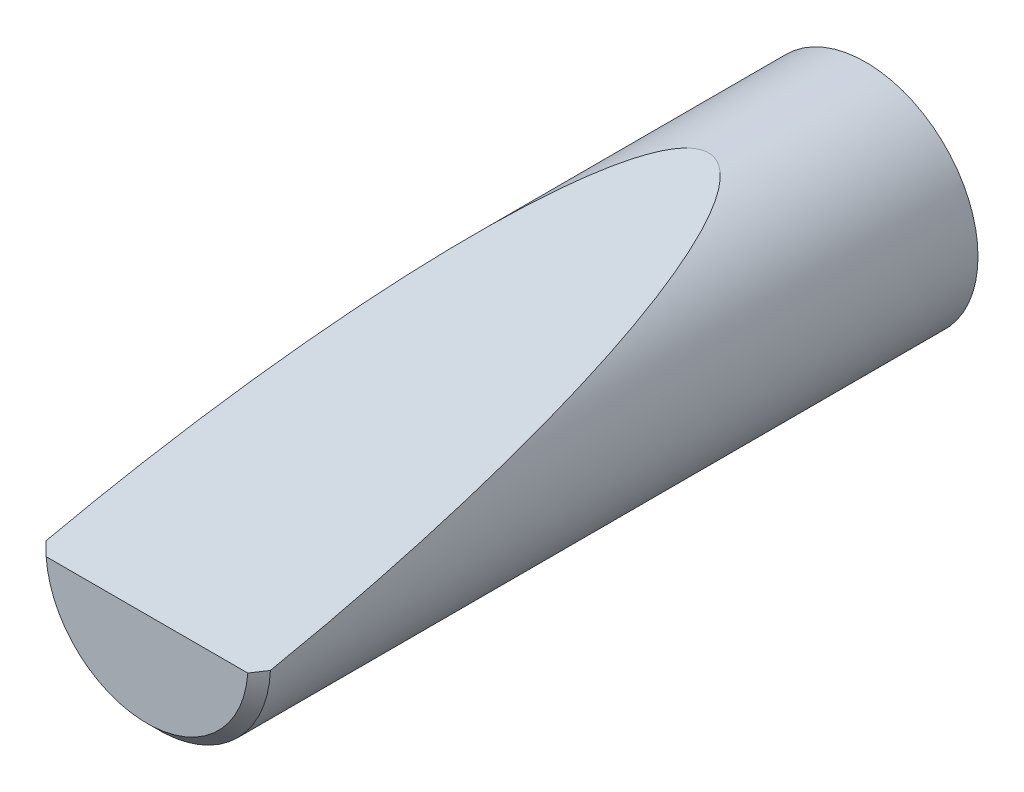
ISO-10303-21;
HEADER;
FILE_DESCRIPTION(('STEP AP214'),'2;1');
FILE_NAME('part.step','',(''),(''),'','','');
FILE_SCHEMA(('AUTOMOTIVE_DESIGN { 1 0 10303 214 1 1 1 1 }'));
ENDSEC;
DATA;
#1=APPLICATION_CONTEXT('core data for automotive mechanical design processes');
#2=APPLICATION_PROTOCOL_DEFINITION('international standard','automotive_design',2000,#1);
#3=PRODUCT_CONTEXT('',#1,'mechanical');
#4=PRODUCT('Part','Part','',(#3));
#5=PRODUCT_RELATED_PRODUCT_CATEGORY('part','',(#4));
#6=PRODUCT_DEFINITION_FORMATION('','',#4);
#7=PRODUCT_DEFINITION_CONTEXT('part definition',#1,'design');
#8=PRODUCT_DEFINITION('design','',#6,#7);
#9=PRODUCT_DEFINITION_SHAPE('','',#8);
#10=(LENGTH_UNIT() NAMED_UNIT(*) SI_UNIT(.MILLI.,.METRE.));
#11=(NAMED_UNIT(*) PLANE_ANGLE_UNIT() SI_UNIT($,.RADIAN.));
#12=(NAMED_UNIT(*) SI_UNIT($,.STERADIAN.) SOLID_ANGLE_UNIT());
#13=UNCERTAINTY_MEASURE_WITH_UNIT(LENGTH_MEASURE(1.E-05),#10,'distance_accuracy_value','');
#14=(GEOMETRIC_REPRESENTATION_CONTEXT(3) GLOBAL_UNCERTAINTY_ASSIGNED_CONTEXT((#13)) GLOBAL_UNIT_ASSIGNED_CONTEXT((#10,
#11,#12)) REPRESENTATION_CONTEXT('',''));
#15=CARTESIAN_POINT('',(0.,0.,0.));
#16=DIRECTION('',(0.,0.,1.));
#17=DIRECTION('',(1.,0.,0.));
#18=AXIS2_PLACEMENT_3D('',#15,#16,#17);
#19=CARTESIAN_POINT('',(0.,0.,0.));
#20=DIRECTION('',(0.,0.,1.));
#21=DIRECTION('',(1.,0.,0.));
#22=AXIS2_PLACEMENT_3D('',#19,#20,#21);
#23=PLANE('',#22);
#24=CARTESIAN_POINT('',(0.,0.,0.));
#25=DIRECTION('',(0.,0.,1.));
#26=DIRECTION('',(1.,0.,0.));
#27=AXIS2_PLACEMENT_3D('',#24,#25,#26);
#28=CIRCLE('',#27,10.);
#29=CARTESIAN_POINT('',(10.,0.,0.));
#30=VERTEX_POINT('',#29);
#31=EDGE_CURVE('E95',#30,#30,#28,.T.);
#32=ORIENTED_EDGE('',*,*,#31,.F.);
#33=EDGE_LOOP('',(#32));
#34=FACE_BOUND('',#33,.T.);
#35=CARTESIAN_POINT('',(0.,0.,0.));
#36=DIRECTION('',(0.,0.,-1.));
#37=DIRECTION('',(-1.,0.,0.));
#38=AXIS2_PLACEMENT_3D('',#35,#36,#37);
#39=CIRCLE('',#38,6.);
#40=CARTESIAN_POINT('',(-6.,0.,0.));
#41=VERTEX_POINT('',#40);
#42=EDGE_CURVE('E90',#41,#41,#39,.T.);
#43=ORIENTED_EDGE('',*,*,#42,.F.);
#44=EDGE_LOOP('',(#43));
#45=FACE_BOUND('',#44,.T.);
#46=ADVANCED_FACE('F41',(#34,#45),#23,.F.);
#47=CARTESIAN_POINT('',(0.,0.,64.));
#48=DIRECTION('',(0.,0.,-1.));
#49=DIRECTION('',(-1.,0.,0.));
#50=AXIS2_PLACEMENT_3D('',#47,#48,#49);
#51=CYLINDRICAL_SURFACE('',#50,10.);
#52=ORIENTED_EDGE('',*,*,#31,.T.);
#53=EDGE_LOOP('',(#52));
#54=FACE_BOUND('',#53,.T.);
#55=CARTESIAN_POINT('',(0.,0.,63.));
#56=DIRECTION('',(0.,0.,1.));
#57=DIRECTION('',(1.,0.,0.));
#58=AXIS2_PLACEMENT_3D('',#55,#56,#57);
#59=CIRCLE('',#58,10.);
#60=CARTESIAN_POINT('',(9.99137375755488,-0.415271521830745,63.));
#61=VERTEX_POINT('',#60);
#62=CARTESIAN_POINT('',(-9.99137375755488,-0.415271521830745,63.));
#63=VERTEX_POINT('',#62);
#64=EDGE_CURVE('E101',#61,#63,#59,.F.);
#65=ORIENTED_EDGE('',*,*,#64,.T.);
#66=CARTESIAN_POINT('',(0.,0.,61.0463010947861));
#67=DIRECTION('',(0.,0.978147600733807,0.207911690817753));
#68=DIRECTION('',(0.,0.207911690817753,-0.978147600733807));
#69=AXIS2_PLACEMENT_3D('',#66,#67,#68);
#70=ELLIPSE('',#69,48.0973434474428,10.);
#71=EDGE_CURVE('E68',#61,#63,#70,.T.);
#72=ORIENTED_EDGE('',*,*,#71,.F.);
#73=EDGE_LOOP('',(#65,#72));
#74=FACE_BOUND('',#73,.T.);
#75=ADVANCED_FACE('F115',(#54,#74),#51,.T.);
#76=CARTESIAN_POINT('',(0.,0.,64.));
#77=DIRECTION('',(0.,0.,1.));
#78=DIRECTION('',(1.,0.,0.));
#79=AXIS2_PLACEMENT_3D('',#76,#77,#78);
#80=PLANE('',#79);
#81=CARTESIAN_POINT('',(0.,0.,64.));
#82=DIRECTION('',(0.,0.,1.));
#83=DIRECTION('',(1.,0.,0.));
#84=AXIS2_PLACEMENT_3D('',#81,#82,#83);
#85=CIRCLE('',#84,9.00000000000001);
#86=CARTESIAN_POINT('',(-8.97807506638076,-0.627828083500761,64.));
#87=VERTEX_POINT('',#86);
#88=CARTESIAN_POINT('',(8.97807506638076,-0.627828083500761,64.));
#89=VERTEX_POINT('',#88);
#90=EDGE_CURVE('E98',#87,#89,#85,.T.);
#91=ORIENTED_EDGE('',*,*,#90,.T.);
#92=DIRECTION('',(-1.,0.,0.));
#93=VECTOR('',#92,1.);
#94=CARTESIAN_POINT('',(99.9642784226795,-0.627828083500761,64.));
#95=LINE('',#94,#93);
#96=EDGE_CURVE('E63',#89,#87,#95,.T.);
#97=ORIENTED_EDGE('',*,*,#96,.T.);
#98=EDGE_LOOP('',(#91,#97));
#99=FACE_BOUND('',#98,.T.);
#100=ADVANCED_FACE('F111',(#99),#80,.T.);
#101=CARTESIAN_POINT('',(0.,0.,64.));
#102=DIRECTION('',(0.,0.,-1.));
#103=DIRECTION('',(-1.,0.,0.));
#104=AXIS2_PLACEMENT_3D('',#101,#102,#103);
#105=CONICAL_SURFACE('',#104,9.00000000000001,0.785398163397444);
#106=ORIENTED_EDGE('',*,*,#90,.F.);
#107=CARTESIAN_POINT('',(-8.97787160501692,-0.627870594813096,64.0002));
#108=CARTESIAN_POINT('',(-9.14714145675765,-0.592496099746864,63.8337760854038));
#109=CARTESIAN_POINT('',(-9.3162517275177,-0.557088719369856,63.6671974575844));
#110=CARTESIAN_POINT('',(-9.65415309148165,-0.486208191265557,63.3337307908891));
#111=CARTESIAN_POINT('',(-9.82294418471501,-0.450735043544336,63.1668427520419));
#112=CARTESIAN_POINT('',(-9.99157569699715,-0.41522901051841,62.9998));
#113=B_SPLINE_CURVE_WITH_KNOTS('',3,(#107,#108,#109,#110,#111,#112),.UNSPECIFIED.,.F.,.F.,(4,2,
4),(0.,0.720002534419931,1.44000500238097),.UNSPECIFIED.);
#114=EDGE_CURVE('E11',#87,#63,#113,.T.);
#115=ORIENTED_EDGE('',*,*,#114,.T.);
#116=ORIENTED_EDGE('',*,*,#64,.F.);
#117=CARTESIAN_POINT('',(9.99157569699715,-0.41522901051841,62.9998));
#118=CARTESIAN_POINT('',(9.82294418471501,-0.450735043544336,63.1668427520419));
#119=CARTESIAN_POINT('',(9.65415309148165,-0.486208191265556,63.3337307908891));
#120=CARTESIAN_POINT('',(9.3162517275177,-0.557088719369856,63.6671974575844));
#121=CARTESIAN_POINT('',(9.14714145675765,-0.592496099746863,63.8337760854038));
#122=CARTESIAN_POINT('',(8.97787160501692,-0.627870594813095,64.0002));
#123=B_SPLINE_CURVE_WITH_KNOTS('',3,(#117,#118,#119,#120,#121,#122),.UNSPECIFIED.,.F.,.F.,(4,2,
4),(0.,0.72000246796104,1.44000500238097),.UNSPECIFIED.);
#124=EDGE_CURVE('E56',#61,#89,#123,.T.);
#125=ORIENTED_EDGE('',*,*,#124,.T.);
#126=EDGE_LOOP('',(#106,#115,#116,#125));
#127=FACE_BOUND('',#126,.T.);
#128=ADVANCED_FACE('F44',(#127),#105,.T.);
#129=CARTESIAN_POINT('',(99.9642784226795,-0.627828083500761,64.));
#130=DIRECTION('',(0.,0.978147600733807,0.207911690817753));
#131=DIRECTION('',(0.,-0.207911690817753,0.978147600733807));
#132=AXIS2_PLACEMENT_3D('',#129,#130,#131);
#133=PLANE('',#132);
#134=ORIENTED_EDGE('',*,*,#114,.F.);
#135=ORIENTED_EDGE('',*,*,#96,.F.);
#136=ORIENTED_EDGE('',*,*,#124,.F.);
#137=ORIENTED_EDGE('',*,*,#71,.T.);
#138=EDGE_LOOP('',(#134,#135,#136,#137));
#139=FACE_BOUND('',#138,.T.);
#140=ADVANCED_FACE('F80',(#139),#133,.T.);
#141=CARTESIAN_POINT('',(0.,0.,9.1905989232415));
#142=DIRECTION('',(0.,0.,-1.));
#143=DIRECTION('',(-1.,0.,0.));
#144=AXIS2_PLACEMENT_3D('',#141,#142,#143);
#145=CONICAL_SURFACE('',#144,4.,1.0471975511966);
#146=CARTESIAN_POINT('',(0.,0.,11.5));
#147=VERTEX_POINT('',#146);
#148=VERTEX_LOOP('',#147);
#149=FACE_BOUND('',#148,.T.);
#150=CARTESIAN_POINT('',(0.,0.,9.1905989232415));
#151=DIRECTION('',(0.,0.,-1.));
#152=DIRECTION('',(-1.,0.,0.));
#153=AXIS2_PLACEMENT_3D('',#150,#151,#152);
#154=CIRCLE('',#153,4.);
#155=CARTESIAN_POINT('',(-4.,0.,9.1905989232415));
#156=VERTEX_POINT('',#155);
#157=EDGE_CURVE('E84',#156,#156,#154,.T.);
#158=ORIENTED_EDGE('',*,*,#157,.T.);
#159=EDGE_LOOP('',(#158));
#160=FACE_BOUND('',#159,.T.);
#161=ADVANCED_FACE('F76',(#149,#160),#145,.F.);
#162=CARTESIAN_POINT('',(0.,0.,0.));
#163=DIRECTION('',(0.,0.,-1.));
#164=DIRECTION('',(-1.,0.,0.));
#165=AXIS2_PLACEMENT_3D('',#162,#163,#164);
#166=CYLINDRICAL_SURFACE('',#165,4.);
#167=ORIENTED_EDGE('',*,*,#157,.F.);
#168=EDGE_LOOP('',(#167));
#169=FACE_BOUND('',#168,.T.);
#170=CARTESIAN_POINT('',(0.,0.,2.));
#171=DIRECTION('',(0.,0.,-1.));
#172=DIRECTION('',(-1.,0.,0.));
#173=AXIS2_PLACEMENT_3D('',#170,#171,#172);
#174=CIRCLE('',#173,4.);
#175=CARTESIAN_POINT('',(-4.,0.,2.));
#176=VERTEX_POINT('',#175);
#177=EDGE_CURVE('E86',#176,#176,#174,.T.);
#178=ORIENTED_EDGE('',*,*,#177,.T.);
#179=EDGE_LOOP('',(#178));
#180=FACE_BOUND('',#179,.T.);
#181=ADVANCED_FACE('F79',(#169,#180),#166,.F.);
#182=CARTESIAN_POINT('',(0.,0.,0.));
#183=DIRECTION('',(0.,0.,-1.));
#184=DIRECTION('',(-1.,0.,0.));
#185=AXIS2_PLACEMENT_3D('',#182,#183,#184);
#186=CONICAL_SURFACE('',#185,6.,0.785398163397448);
#187=ORIENTED_EDGE('',*,*,#177,.F.);
#188=EDGE_LOOP('',(#187));
#189=FACE_BOUND('',#188,.T.);
#190=ORIENTED_EDGE('',*,*,#42,.T.);
#191=EDGE_LOOP('',(#190));
#192=FACE_BOUND('',#191,.T.);
#193=ADVANCED_FACE('F154',(#189,#192),#186,.F.);
#194=CLOSED_SHELL('',(#46,#75,#100,#128,#140,#161,#181,#193));
#195=MANIFOLD_SOLID_BREP('B2',#194);
#196=ADVANCED_BREP_SHAPE_REPRESENTATION('',(#18,#195),#14);
#197=SHAPE_DEFINITION_REPRESENTATION(#9,#196);
ENDSEC;
END-ISO-10303-21;
